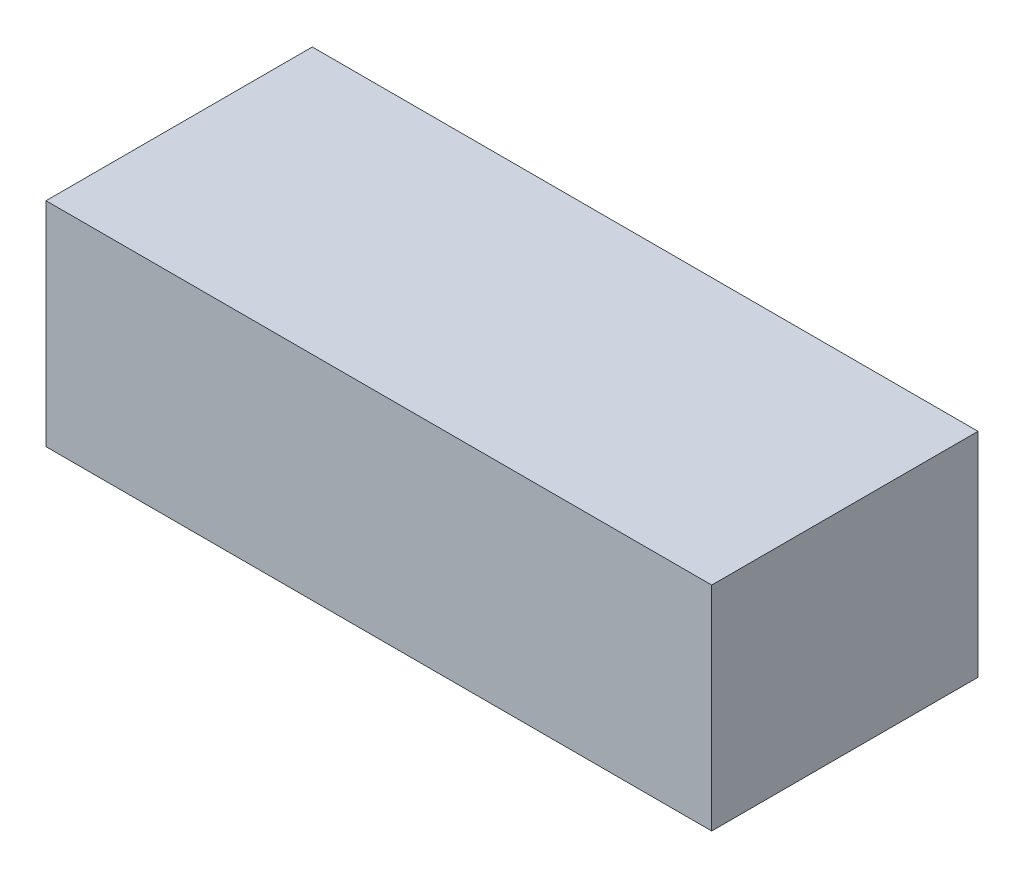
ISO-10303-21;
HEADER;
FILE_DESCRIPTION(('STEP AP214'),'2;1');
FILE_NAME('part.step','',(''),(''),'','','');
FILE_SCHEMA(('AUTOMOTIVE_DESIGN { 1 0 10303 214 1 1 1 1 }'));
ENDSEC;
DATA;
#1=APPLICATION_CONTEXT('core data for automotive mechanical design processes');
#2=APPLICATION_PROTOCOL_DEFINITION('international standard','automotive_design',2000,#1);
#3=PRODUCT_CONTEXT('',#1,'mechanical');
#4=PRODUCT('Part','Part','',(#3));
#5=PRODUCT_RELATED_PRODUCT_CATEGORY('part','',(#4));
#6=PRODUCT_DEFINITION_FORMATION('','',#4);
#7=PRODUCT_DEFINITION_CONTEXT('part definition',#1,'design');
#8=PRODUCT_DEFINITION('design','',#6,#7);
#9=PRODUCT_DEFINITION_SHAPE('','',#8);
#10=(LENGTH_UNIT() NAMED_UNIT(*) SI_UNIT(.MILLI.,.METRE.));
#11=(NAMED_UNIT(*) PLANE_ANGLE_UNIT() SI_UNIT($,.RADIAN.));
#12=(NAMED_UNIT(*) SI_UNIT($,.STERADIAN.) SOLID_ANGLE_UNIT());
#13=UNCERTAINTY_MEASURE_WITH_UNIT(LENGTH_MEASURE(1.E-05),#10,'distance_accuracy_value','');
#14=(GEOMETRIC_REPRESENTATION_CONTEXT(3) GLOBAL_UNCERTAINTY_ASSIGNED_CONTEXT((#13)) GLOBAL_UNIT_ASSIGNED_CONTEXT((#10,
#11,#12)) REPRESENTATION_CONTEXT('',''));
#15=CARTESIAN_POINT('',(0.,0.,0.));
#16=DIRECTION('',(0.,0.,1.));
#17=DIRECTION('',(1.,0.,0.));
#18=AXIS2_PLACEMENT_3D('',#15,#16,#17);
#19=CARTESIAN_POINT('',(0.635,0.2032,0.508));
#20=DIRECTION('',(0.,0.,-1.));
#21=DIRECTION('',(0.,-1.,0.));
#22=AXIS2_PLACEMENT_3D('',#19,#20,#21);
#23=PLANE('',#22);
#24=DIRECTION('',(-1.,0.,0.));
#25=VECTOR('',#24,1.);
#26=CARTESIAN_POINT('',(0.635,0.2032,0.508));
#27=LINE('',#26,#25);
#28=CARTESIAN_POINT('',(0.635,0.2032,0.508));
#29=VERTEX_POINT('',#28);
#30=CARTESIAN_POINT('',(-0.635,0.2032,0.508));
#31=VERTEX_POINT('',#30);
#32=EDGE_CURVE('E73',#29,#31,#27,.T.);
#33=ORIENTED_EDGE('',*,*,#32,.T.);
#34=DIRECTION('',(0.,-1.,0.));
#35=VECTOR('',#34,1.);
#36=CARTESIAN_POINT('',(-0.635,0.2032,0.508));
#37=LINE('',#36,#35);
#38=CARTESIAN_POINT('',(-0.635,-0.2032,0.508));
#39=VERTEX_POINT('',#38);
#40=EDGE_CURVE('E67',#31,#39,#37,.T.);
#41=ORIENTED_EDGE('',*,*,#40,.T.);
#42=DIRECTION('',(1.,0.,0.));
#43=VECTOR('',#42,1.);
#44=CARTESIAN_POINT('',(-0.635,-0.2032,0.508));
#45=LINE('',#44,#43);
#46=CARTESIAN_POINT('',(0.635,-0.2032,0.508));
#47=VERTEX_POINT('',#46);
#48=EDGE_CURVE('E75',#39,#47,#45,.T.);
#49=ORIENTED_EDGE('',*,*,#48,.T.);
#50=DIRECTION('',(0.,1.,0.));
#51=VECTOR('',#50,1.);
#52=CARTESIAN_POINT('',(0.635,-0.2032,0.508));
#53=LINE('',#52,#51);
#54=EDGE_CURVE('E11',#47,#29,#53,.T.);
#55=ORIENTED_EDGE('',*,*,#54,.T.);
#56=EDGE_LOOP('',(#33,#41,#49,#55));
#57=FACE_BOUND('',#56,.T.);
#58=ADVANCED_FACE('F16',(#57),#23,.F.);
#59=CARTESIAN_POINT('',(0.635,0.2032,0.));
#60=DIRECTION('',(0.,0.,-1.));
#61=DIRECTION('',(0.,-1.,0.));
#62=AXIS2_PLACEMENT_3D('',#59,#60,#61);
#63=PLANE('',#62);
#64=DIRECTION('',(0.,1.,0.));
#65=VECTOR('',#64,1.);
#66=CARTESIAN_POINT('',(0.635,-0.2032,0.));
#67=LINE('',#66,#65);
#68=CARTESIAN_POINT('',(0.635,-0.2032,0.));
#69=VERTEX_POINT('',#68);
#70=CARTESIAN_POINT('',(0.635,0.2032,0.));
#71=VERTEX_POINT('',#70);
#72=EDGE_CURVE('E27',#69,#71,#67,.T.);
#73=ORIENTED_EDGE('',*,*,#72,.F.);
#74=DIRECTION('',(1.,0.,0.));
#75=VECTOR('',#74,1.);
#76=CARTESIAN_POINT('',(-0.635,-0.2032,0.));
#77=LINE('',#76,#75);
#78=CARTESIAN_POINT('',(-0.635,-0.2032,0.));
#79=VERTEX_POINT('',#78);
#80=EDGE_CURVE('E98',#79,#69,#77,.T.);
#81=ORIENTED_EDGE('',*,*,#80,.F.);
#82=DIRECTION('',(0.,-1.,0.));
#83=VECTOR('',#82,1.);
#84=CARTESIAN_POINT('',(-0.635,0.2032,0.));
#85=LINE('',#84,#83);
#86=CARTESIAN_POINT('',(-0.635,0.2032,0.));
#87=VERTEX_POINT('',#86);
#88=EDGE_CURVE('E84',#87,#79,#85,.T.);
#89=ORIENTED_EDGE('',*,*,#88,.F.);
#90=DIRECTION('',(-1.,0.,0.));
#91=VECTOR('',#90,1.);
#92=CARTESIAN_POINT('',(0.635,0.2032,0.));
#93=LINE('',#92,#91);
#94=EDGE_CURVE('E20',#71,#87,#93,.T.);
#95=ORIENTED_EDGE('',*,*,#94,.F.);
#96=EDGE_LOOP('',(#73,#81,#89,#95));
#97=FACE_BOUND('',#96,.T.);
#98=ADVANCED_FACE('F162',(#97),#63,.T.);
#99=CARTESIAN_POINT('',(0.635,-0.2032,0.));
#100=DIRECTION('',(-1.,0.,0.));
#101=DIRECTION('',(0.,0.,1.));
#102=AXIS2_PLACEMENT_3D('',#99,#100,#101);
#103=PLANE('',#102);
#104=ORIENTED_EDGE('',*,*,#72,.T.);
#105=DIRECTION('',(0.,0.,1.));
#106=VECTOR('',#105,1.);
#107=CARTESIAN_POINT('',(0.635,0.2032,0.));
#108=LINE('',#107,#106);
#109=EDGE_CURVE('E78',#71,#29,#108,.T.);
#110=ORIENTED_EDGE('',*,*,#109,.T.);
#111=ORIENTED_EDGE('',*,*,#54,.F.);
#112=DIRECTION('',(0.,0.,1.));
#113=VECTOR('',#112,1.);
#114=CARTESIAN_POINT('',(0.635,-0.2032,0.));
#115=LINE('',#114,#113);
#116=EDGE_CURVE('E106',#69,#47,#115,.T.);
#117=ORIENTED_EDGE('',*,*,#116,.F.);
#118=EDGE_LOOP('',(#104,#110,#111,#117));
#119=FACE_BOUND('',#118,.T.);
#120=ADVANCED_FACE('F79',(#119),#103,.F.);
#121=CARTESIAN_POINT('',(-0.635,-0.2032,0.));
#122=DIRECTION('',(0.,1.,0.));
#123=DIRECTION('',(1.,0.,0.));
#124=AXIS2_PLACEMENT_3D('',#121,#122,#123);
#125=PLANE('',#124);
#126=ORIENTED_EDGE('',*,*,#80,.T.);
#127=ORIENTED_EDGE('',*,*,#116,.T.);
#128=ORIENTED_EDGE('',*,*,#48,.F.);
#129=DIRECTION('',(0.,0.,1.));
#130=VECTOR('',#129,1.);
#131=CARTESIAN_POINT('',(-0.635,-0.2032,0.));
#132=LINE('',#131,#130);
#133=EDGE_CURVE('E99',#79,#39,#132,.T.);
#134=ORIENTED_EDGE('',*,*,#133,.F.);
#135=EDGE_LOOP('',(#126,#127,#128,#134));
#136=FACE_BOUND('',#135,.T.);
#137=ADVANCED_FACE('F142',(#136),#125,.F.);
#138=CARTESIAN_POINT('',(-0.635,0.2032,0.));
#139=DIRECTION('',(1.,0.,0.));
#140=DIRECTION('',(0.,1.,0.));
#141=AXIS2_PLACEMENT_3D('',#138,#139,#140);
#142=PLANE('',#141);
#143=ORIENTED_EDGE('',*,*,#88,.T.);
#144=ORIENTED_EDGE('',*,*,#133,.T.);
#145=ORIENTED_EDGE('',*,*,#40,.F.);
#146=DIRECTION('',(0.,0.,1.));
#147=VECTOR('',#146,1.);
#148=CARTESIAN_POINT('',(-0.635,0.2032,0.));
#149=LINE('',#148,#147);
#150=EDGE_CURVE('E86',#87,#31,#149,.T.);
#151=ORIENTED_EDGE('',*,*,#150,.F.);
#152=EDGE_LOOP('',(#143,#144,#145,#151));
#153=FACE_BOUND('',#152,.T.);
#154=ADVANCED_FACE('F132',(#153),#142,.F.);
#155=CARTESIAN_POINT('',(0.635,0.2032,0.));
#156=DIRECTION('',(0.,-1.,0.));
#157=DIRECTION('',(0.,0.,-1.));
#158=AXIS2_PLACEMENT_3D('',#155,#156,#157);
#159=PLANE('',#158);
#160=ORIENTED_EDGE('',*,*,#94,.T.);
#161=ORIENTED_EDGE('',*,*,#150,.T.);
#162=ORIENTED_EDGE('',*,*,#32,.F.);
#163=ORIENTED_EDGE('',*,*,#109,.F.);
#164=EDGE_LOOP('',(#160,#161,#162,#163));
#165=FACE_BOUND('',#164,.T.);
#166=ADVANCED_FACE('F18',(#165),#159,.F.);
#167=CLOSED_SHELL('',(#58,#98,#120,#137,#154,#166));
#168=MANIFOLD_SOLID_BREP('B1',#167);
#169=ADVANCED_BREP_SHAPE_REPRESENTATION('',(#18,#168),#14);
#170=SHAPE_DEFINITION_REPRESENTATION(#9,#169);
ENDSEC;
END-ISO-10303-21;
